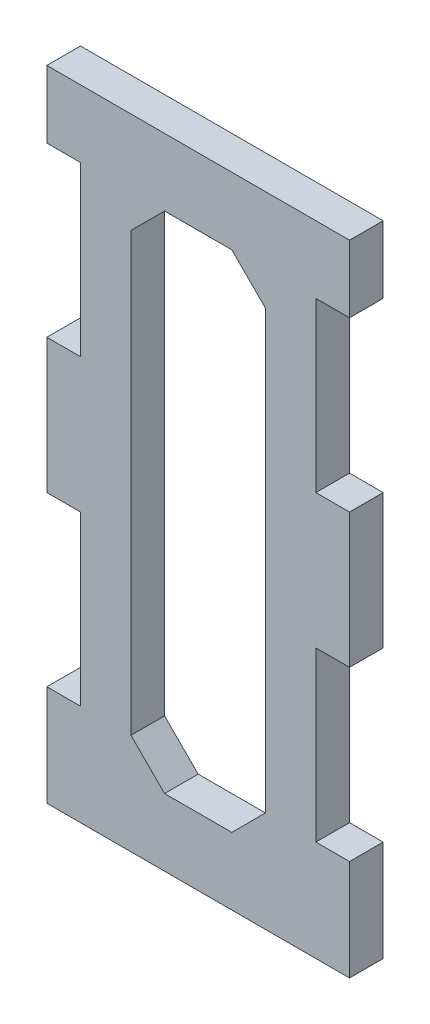
ISO-10303-21;
HEADER;
FILE_DESCRIPTION(('STEP AP214'),'2;1');
FILE_NAME('part.step','',(''),(''),'','','');
FILE_SCHEMA(('AUTOMOTIVE_DESIGN { 1 0 10303 214 1 1 1 1 }'));
ENDSEC;
DATA;
#1=APPLICATION_CONTEXT('core data for automotive mechanical design processes');
#2=APPLICATION_PROTOCOL_DEFINITION('international standard','automotive_design',2000,#1);
#3=PRODUCT_CONTEXT('',#1,'mechanical');
#4=PRODUCT('Part','Part','',(#3));
#5=PRODUCT_RELATED_PRODUCT_CATEGORY('part','',(#4));
#6=PRODUCT_DEFINITION_FORMATION('','',#4);
#7=PRODUCT_DEFINITION_CONTEXT('part definition',#1,'design');
#8=PRODUCT_DEFINITION('design','',#6,#7);
#9=PRODUCT_DEFINITION_SHAPE('','',#8);
#10=(LENGTH_UNIT() NAMED_UNIT(*) SI_UNIT(.MILLI.,.METRE.));
#11=(NAMED_UNIT(*) PLANE_ANGLE_UNIT() SI_UNIT($,.RADIAN.));
#12=(NAMED_UNIT(*) SI_UNIT($,.STERADIAN.) SOLID_ANGLE_UNIT());
#13=UNCERTAINTY_MEASURE_WITH_UNIT(LENGTH_MEASURE(1.E-05),#10,'distance_accuracy_value','');
#14=(GEOMETRIC_REPRESENTATION_CONTEXT(3) GLOBAL_UNCERTAINTY_ASSIGNED_CONTEXT((#13)) GLOBAL_UNIT_ASSIGNED_CONTEXT((#10,
#11,#12)) REPRESENTATION_CONTEXT('',''));
#15=CARTESIAN_POINT('',(0.,0.,0.));
#16=DIRECTION('',(0.,0.,1.));
#17=DIRECTION('',(1.,0.,0.));
#18=AXIS2_PLACEMENT_3D('',#15,#16,#17);
#19=CARTESIAN_POINT('',(0.,0.,10.));
#20=DIRECTION('',(1.,0.,0.));
#21=DIRECTION('',(0.,0.,-1.));
#22=AXIS2_PLACEMENT_3D('',#19,#20,#21);
#23=PLANE('',#22);
#24=DIRECTION('',(0.,-1.,0.));
#25=VECTOR('',#24,1.);
#26=CARTESIAN_POINT('',(0.,0.,0.));
#27=LINE('',#26,#25);
#28=CARTESIAN_POINT('',(0.,30.,0.));
#29=VERTEX_POINT('',#28);
#30=CARTESIAN_POINT('',(0.,0.,0.));
#31=VERTEX_POINT('',#30);
#32=EDGE_CURVE('E274',#29,#31,#27,.T.);
#33=ORIENTED_EDGE('',*,*,#32,.T.);
#34=DIRECTION('',(0.,0.,-1.));
#35=VECTOR('',#34,1.);
#36=CARTESIAN_POINT('',(0.,0.,10.));
#37=LINE('',#36,#35);
#38=CARTESIAN_POINT('',(0.,0.,10.));
#39=VERTEX_POINT('',#38);
#40=EDGE_CURVE('E11',#39,#31,#37,.T.);
#41=ORIENTED_EDGE('',*,*,#40,.F.);
#42=DIRECTION('',(0.,-1.,0.));
#43=VECTOR('',#42,1.);
#44=CARTESIAN_POINT('',(0.,0.,10.));
#45=LINE('',#44,#43);
#46=CARTESIAN_POINT('',(0.,30.,10.));
#47=VERTEX_POINT('',#46);
#48=EDGE_CURVE('E286',#47,#39,#45,.T.);
#49=ORIENTED_EDGE('',*,*,#48,.F.);
#50=DIRECTION('',(0.,0.,-1.));
#51=VECTOR('',#50,1.);
#52=CARTESIAN_POINT('',(0.,30.,10.));
#53=LINE('',#52,#51);
#54=EDGE_CURVE('E328',#47,#29,#53,.T.);
#55=ORIENTED_EDGE('',*,*,#54,.T.);
#56=EDGE_LOOP('',(#33,#41,#49,#55));
#57=FACE_BOUND('',#56,.T.);
#58=ADVANCED_FACE('F33',(#57),#23,.F.);
#59=CARTESIAN_POINT('',(0.,0.,10.));
#60=DIRECTION('',(0.,1.,0.));
#61=DIRECTION('',(-1.,0.,0.));
#62=AXIS2_PLACEMENT_3D('',#59,#60,#61);
#63=PLANE('',#62);
#64=DIRECTION('',(1.,0.,0.));
#65=VECTOR('',#64,1.);
#66=CARTESIAN_POINT('',(0.,0.,0.));
#67=LINE('',#66,#65);
#68=CARTESIAN_POINT('',(90.,0.,0.));
#69=VERTEX_POINT('',#68);
#70=EDGE_CURVE('E331',#31,#69,#67,.T.);
#71=ORIENTED_EDGE('',*,*,#70,.T.);
#72=DIRECTION('',(0.,0.,-1.));
#73=VECTOR('',#72,1.);
#74=CARTESIAN_POINT('',(90.,0.,10.));
#75=LINE('',#74,#73);
#76=CARTESIAN_POINT('',(90.,0.,10.));
#77=VERTEX_POINT('',#76);
#78=EDGE_CURVE('E40',#77,#69,#75,.T.);
#79=ORIENTED_EDGE('',*,*,#78,.F.);
#80=DIRECTION('',(1.,0.,0.));
#81=VECTOR('',#80,1.);
#82=CARTESIAN_POINT('',(0.,0.,10.));
#83=LINE('',#82,#81);
#84=EDGE_CURVE('E289',#39,#77,#83,.T.);
#85=ORIENTED_EDGE('',*,*,#84,.F.);
#86=ORIENTED_EDGE('',*,*,#40,.T.);
#87=EDGE_LOOP('',(#71,#79,#85,#86));
#88=FACE_BOUND('',#87,.T.);
#89=ADVANCED_FACE('F446',(#88),#63,.F.);
#90=CARTESIAN_POINT('',(90.,0.,10.));
#91=DIRECTION('',(-1.,0.,0.));
#92=DIRECTION('',(0.,0.,1.));
#93=AXIS2_PLACEMENT_3D('',#90,#91,#92);
#94=PLANE('',#93);
#95=DIRECTION('',(0.,1.,0.));
#96=VECTOR('',#95,1.);
#97=CARTESIAN_POINT('',(90.,0.,0.));
#98=LINE('',#97,#96);
#99=CARTESIAN_POINT('',(90.,30.,0.));
#100=VERTEX_POINT('',#99);
#101=EDGE_CURVE('E333',#69,#100,#98,.T.);
#102=ORIENTED_EDGE('',*,*,#101,.T.);
#103=DIRECTION('',(0.,0.,-1.));
#104=VECTOR('',#103,1.);
#105=CARTESIAN_POINT('',(90.,30.,10.));
#106=LINE('',#105,#104);
#107=CARTESIAN_POINT('',(90.,30.,10.));
#108=VERTEX_POINT('',#107);
#109=EDGE_CURVE('E418',#108,#100,#106,.T.);
#110=ORIENTED_EDGE('',*,*,#109,.F.);
#111=DIRECTION('',(0.,1.,0.));
#112=VECTOR('',#111,1.);
#113=CARTESIAN_POINT('',(90.,0.,10.));
#114=LINE('',#113,#112);
#115=EDGE_CURVE('E292',#77,#108,#114,.T.);
#116=ORIENTED_EDGE('',*,*,#115,.F.);
#117=ORIENTED_EDGE('',*,*,#78,.T.);
#118=EDGE_LOOP('',(#102,#110,#116,#117));
#119=FACE_BOUND('',#118,.T.);
#120=ADVANCED_FACE('F425',(#119),#94,.F.);
#121=CARTESIAN_POINT('',(90.,30.,10.));
#122=DIRECTION('',(0.,-1.,0.));
#123=DIRECTION('',(1.,0.,0.));
#124=AXIS2_PLACEMENT_3D('',#121,#122,#123);
#125=PLANE('',#124);
#126=DIRECTION('',(-1.,0.,0.));
#127=VECTOR('',#126,1.);
#128=CARTESIAN_POINT('',(90.,30.,0.));
#129=LINE('',#128,#127);
#130=CARTESIAN_POINT('',(80.,30.,0.));
#131=VERTEX_POINT('',#130);
#132=EDGE_CURVE('E335',#100,#131,#129,.T.);
#133=ORIENTED_EDGE('',*,*,#132,.T.);
#134=DIRECTION('',(0.,0.,-1.));
#135=VECTOR('',#134,1.);
#136=CARTESIAN_POINT('',(80.,30.,10.));
#137=LINE('',#136,#135);
#138=CARTESIAN_POINT('',(80.,30.,10.));
#139=VERTEX_POINT('',#138);
#140=EDGE_CURVE('E415',#139,#131,#137,.T.);
#141=ORIENTED_EDGE('',*,*,#140,.F.);
#142=DIRECTION('',(-1.,0.,0.));
#143=VECTOR('',#142,1.);
#144=CARTESIAN_POINT('',(90.,30.,10.));
#145=LINE('',#144,#143);
#146=EDGE_CURVE('E294',#108,#139,#145,.T.);
#147=ORIENTED_EDGE('',*,*,#146,.F.);
#148=ORIENTED_EDGE('',*,*,#109,.T.);
#149=EDGE_LOOP('',(#133,#141,#147,#148));
#150=FACE_BOUND('',#149,.T.);
#151=ADVANCED_FACE('F434',(#150),#125,.F.);
#152=CARTESIAN_POINT('',(80.,30.,10.));
#153=DIRECTION('',(-1.,0.,0.));
#154=DIRECTION('',(0.,-1.,0.));
#155=AXIS2_PLACEMENT_3D('',#152,#153,#154);
#156=PLANE('',#155);
#157=DIRECTION('',(0.,1.,0.));
#158=VECTOR('',#157,1.);
#159=CARTESIAN_POINT('',(80.,30.,0.));
#160=LINE('',#159,#158);
#161=CARTESIAN_POINT('',(80.,80.,0.));
#162=VERTEX_POINT('',#161);
#163=EDGE_CURVE('E337',#131,#162,#160,.T.);
#164=ORIENTED_EDGE('',*,*,#163,.T.);
#165=DIRECTION('',(0.,0.,-1.));
#166=VECTOR('',#165,1.);
#167=CARTESIAN_POINT('',(80.,80.,10.));
#168=LINE('',#167,#166);
#169=CARTESIAN_POINT('',(80.,80.,10.));
#170=VERTEX_POINT('',#169);
#171=EDGE_CURVE('E412',#170,#162,#168,.T.);
#172=ORIENTED_EDGE('',*,*,#171,.F.);
#173=DIRECTION('',(0.,1.,0.));
#174=VECTOR('',#173,1.);
#175=CARTESIAN_POINT('',(80.,30.,10.));
#176=LINE('',#175,#174);
#177=EDGE_CURVE('E296',#139,#170,#176,.T.);
#178=ORIENTED_EDGE('',*,*,#177,.F.);
#179=ORIENTED_EDGE('',*,*,#140,.T.);
#180=EDGE_LOOP('',(#164,#172,#178,#179));
#181=FACE_BOUND('',#180,.T.);
#182=ADVANCED_FACE('F438',(#181),#156,.F.);
#183=CARTESIAN_POINT('',(80.,80.,10.));
#184=DIRECTION('',(0.,1.,0.));
#185=DIRECTION('',(0.,0.,1.));
#186=AXIS2_PLACEMENT_3D('',#183,#184,#185);
#187=PLANE('',#186);
#188=DIRECTION('',(1.,0.,0.));
#189=VECTOR('',#188,1.);
#190=CARTESIAN_POINT('',(80.,80.,0.));
#191=LINE('',#190,#189);
#192=CARTESIAN_POINT('',(90.,80.,0.));
#193=VERTEX_POINT('',#192);
#194=EDGE_CURVE('E339',#162,#193,#191,.T.);
#195=ORIENTED_EDGE('',*,*,#194,.T.);
#196=DIRECTION('',(0.,0.,-1.));
#197=VECTOR('',#196,1.);
#198=CARTESIAN_POINT('',(90.,80.,10.));
#199=LINE('',#198,#197);
#200=CARTESIAN_POINT('',(90.,80.,10.));
#201=VERTEX_POINT('',#200);
#202=EDGE_CURVE('E409',#201,#193,#199,.T.);
#203=ORIENTED_EDGE('',*,*,#202,.F.);
#204=DIRECTION('',(1.,0.,0.));
#205=VECTOR('',#204,1.);
#206=CARTESIAN_POINT('',(80.,80.,10.));
#207=LINE('',#206,#205);
#208=EDGE_CURVE('E298',#170,#201,#207,.T.);
#209=ORIENTED_EDGE('',*,*,#208,.F.);
#210=ORIENTED_EDGE('',*,*,#171,.T.);
#211=EDGE_LOOP('',(#195,#203,#209,#210));
#212=FACE_BOUND('',#211,.T.);
#213=ADVANCED_FACE('F519',(#212),#187,.F.);
#214=CARTESIAN_POINT('',(90.,80.,10.));
#215=DIRECTION('',(-1.,0.,0.));
#216=DIRECTION('',(0.,-1.,0.));
#217=AXIS2_PLACEMENT_3D('',#214,#215,#216);
#218=PLANE('',#217);
#219=DIRECTION('',(0.,1.,0.));
#220=VECTOR('',#219,1.);
#221=CARTESIAN_POINT('',(90.,80.,0.));
#222=LINE('',#221,#220);
#223=CARTESIAN_POINT('',(90.,120.,0.));
#224=VERTEX_POINT('',#223);
#225=EDGE_CURVE('E341',#193,#224,#222,.T.);
#226=ORIENTED_EDGE('',*,*,#225,.T.);
#227=DIRECTION('',(0.,0.,-1.));
#228=VECTOR('',#227,1.);
#229=CARTESIAN_POINT('',(90.,120.,10.));
#230=LINE('',#229,#228);
#231=CARTESIAN_POINT('',(90.,120.,10.));
#232=VERTEX_POINT('',#231);
#233=EDGE_CURVE('E406',#232,#224,#230,.T.);
#234=ORIENTED_EDGE('',*,*,#233,.F.);
#235=DIRECTION('',(0.,1.,0.));
#236=VECTOR('',#235,1.);
#237=CARTESIAN_POINT('',(90.,80.,10.));
#238=LINE('',#237,#236);
#239=EDGE_CURVE('E300',#201,#232,#238,.T.);
#240=ORIENTED_EDGE('',*,*,#239,.F.);
#241=ORIENTED_EDGE('',*,*,#202,.T.);
#242=EDGE_LOOP('',(#226,#234,#240,#241));
#243=FACE_BOUND('',#242,.T.);
#244=ADVANCED_FACE('F517',(#243),#218,.F.);
#245=CARTESIAN_POINT('',(90.,120.,10.));
#246=DIRECTION('',(0.,-1.,0.));
#247=DIRECTION('',(0.,0.,-1.));
#248=AXIS2_PLACEMENT_3D('',#245,#246,#247);
#249=PLANE('',#248);
#250=DIRECTION('',(-1.,0.,0.));
#251=VECTOR('',#250,1.);
#252=CARTESIAN_POINT('',(90.,120.,0.));
#253=LINE('',#252,#251);
#254=CARTESIAN_POINT('',(80.,120.,0.));
#255=VERTEX_POINT('',#254);
#256=EDGE_CURVE('E343',#224,#255,#253,.T.);
#257=ORIENTED_EDGE('',*,*,#256,.T.);
#258=DIRECTION('',(0.,0.,-1.));
#259=VECTOR('',#258,1.);
#260=CARTESIAN_POINT('',(80.,120.,10.));
#261=LINE('',#260,#259);
#262=CARTESIAN_POINT('',(80.,120.,10.));
#263=VERTEX_POINT('',#262);
#264=EDGE_CURVE('E403',#263,#255,#261,.T.);
#265=ORIENTED_EDGE('',*,*,#264,.F.);
#266=DIRECTION('',(-1.,0.,0.));
#267=VECTOR('',#266,1.);
#268=CARTESIAN_POINT('',(90.,120.,10.));
#269=LINE('',#268,#267);
#270=EDGE_CURVE('E302',#232,#263,#269,.T.);
#271=ORIENTED_EDGE('',*,*,#270,.F.);
#272=ORIENTED_EDGE('',*,*,#233,.T.);
#273=EDGE_LOOP('',(#257,#265,#271,#272));
#274=FACE_BOUND('',#273,.T.);
#275=ADVANCED_FACE('F512',(#274),#249,.F.);
#276=CARTESIAN_POINT('',(80.,120.,10.));
#277=DIRECTION('',(-1.,0.,0.));
#278=DIRECTION('',(0.,-1.,0.));
#279=AXIS2_PLACEMENT_3D('',#276,#277,#278);
#280=PLANE('',#279);
#281=DIRECTION('',(0.,1.,0.));
#282=VECTOR('',#281,1.);
#283=CARTESIAN_POINT('',(80.,120.,0.));
#284=LINE('',#283,#282);
#285=CARTESIAN_POINT('',(79.9999999999999,170.,0.));
#286=VERTEX_POINT('',#285);
#287=EDGE_CURVE('E345',#255,#286,#284,.T.);
#288=ORIENTED_EDGE('',*,*,#287,.T.);
#289=DIRECTION('',(0.,0.,-1.));
#290=VECTOR('',#289,1.);
#291=CARTESIAN_POINT('',(79.9999999999999,170.,10.));
#292=LINE('',#291,#290);
#293=CARTESIAN_POINT('',(79.9999999999999,170.,10.));
#294=VERTEX_POINT('',#293);
#295=EDGE_CURVE('E400',#294,#286,#292,.T.);
#296=ORIENTED_EDGE('',*,*,#295,.F.);
#297=DIRECTION('',(0.,1.,0.));
#298=VECTOR('',#297,1.);
#299=CARTESIAN_POINT('',(80.,120.,10.));
#300=LINE('',#299,#298);
#301=EDGE_CURVE('E304',#263,#294,#300,.T.);
#302=ORIENTED_EDGE('',*,*,#301,.F.);
#303=ORIENTED_EDGE('',*,*,#264,.T.);
#304=EDGE_LOOP('',(#288,#296,#302,#303));
#305=FACE_BOUND('',#304,.T.);
#306=ADVANCED_FACE('F507',(#305),#280,.F.);
#307=CARTESIAN_POINT('',(79.9999999999999,170.,10.));
#308=DIRECTION('',(0.,1.,0.));
#309=DIRECTION('',(0.,0.,1.));
#310=AXIS2_PLACEMENT_3D('',#307,#308,#309);
#311=PLANE('',#310);
#312=DIRECTION('',(1.,0.,0.));
#313=VECTOR('',#312,1.);
#314=CARTESIAN_POINT('',(79.9999999999999,170.,0.));
#315=LINE('',#314,#313);
#316=CARTESIAN_POINT('',(90.,170.,0.));
#317=VERTEX_POINT('',#316);
#318=EDGE_CURVE('E347',#286,#317,#315,.T.);
#319=ORIENTED_EDGE('',*,*,#318,.T.);
#320=DIRECTION('',(0.,0.,-1.));
#321=VECTOR('',#320,1.);
#322=CARTESIAN_POINT('',(90.,170.,10.));
#323=LINE('',#322,#321);
#324=CARTESIAN_POINT('',(90.,170.,10.));
#325=VERTEX_POINT('',#324);
#326=EDGE_CURVE('E397',#325,#317,#323,.T.);
#327=ORIENTED_EDGE('',*,*,#326,.F.);
#328=DIRECTION('',(1.,0.,0.));
#329=VECTOR('',#328,1.);
#330=CARTESIAN_POINT('',(79.9999999999999,170.,10.));
#331=LINE('',#330,#329);
#332=EDGE_CURVE('E306',#294,#325,#331,.T.);
#333=ORIENTED_EDGE('',*,*,#332,.F.);
#334=ORIENTED_EDGE('',*,*,#295,.T.);
#335=EDGE_LOOP('',(#319,#327,#333,#334));
#336=FACE_BOUND('',#335,.T.);
#337=ADVANCED_FACE('F503',(#336),#311,.F.);
#338=CARTESIAN_POINT('',(90.,170.,10.));
#339=DIRECTION('',(-1.,0.,0.));
#340=DIRECTION('',(0.,-1.,0.));
#341=AXIS2_PLACEMENT_3D('',#338,#339,#340);
#342=PLANE('',#341);
#343=DIRECTION('',(0.,1.,0.));
#344=VECTOR('',#343,1.);
#345=CARTESIAN_POINT('',(90.,170.,0.));
#346=LINE('',#345,#344);
#347=CARTESIAN_POINT('',(89.9999999999999,190.,0.));
#348=VERTEX_POINT('',#347);
#349=EDGE_CURVE('E349',#317,#348,#346,.T.);
#350=ORIENTED_EDGE('',*,*,#349,.T.);
#351=DIRECTION('',(0.,0.,-1.));
#352=VECTOR('',#351,1.);
#353=CARTESIAN_POINT('',(89.9999999999999,190.,10.));
#354=LINE('',#353,#352);
#355=CARTESIAN_POINT('',(89.9999999999999,190.,10.));
#356=VERTEX_POINT('',#355);
#357=EDGE_CURVE('E394',#356,#348,#354,.T.);
#358=ORIENTED_EDGE('',*,*,#357,.F.);
#359=DIRECTION('',(0.,1.,0.));
#360=VECTOR('',#359,1.);
#361=CARTESIAN_POINT('',(90.,170.,10.));
#362=LINE('',#361,#360);
#363=EDGE_CURVE('E308',#325,#356,#362,.T.);
#364=ORIENTED_EDGE('',*,*,#363,.F.);
#365=ORIENTED_EDGE('',*,*,#326,.T.);
#366=EDGE_LOOP('',(#350,#358,#364,#365));
#367=FACE_BOUND('',#366,.T.);
#368=ADVANCED_FACE('F498',(#367),#342,.F.);
#369=CARTESIAN_POINT('',(0.,190.,10.));
#370=DIRECTION('',(0.,-1.,0.));
#371=DIRECTION('',(0.,0.,-1.));
#372=AXIS2_PLACEMENT_3D('',#369,#370,#371);
#373=PLANE('',#372);
#374=DIRECTION('',(-1.,0.,0.));
#375=VECTOR('',#374,1.);
#376=CARTESIAN_POINT('',(0.,190.,0.));
#377=LINE('',#376,#375);
#378=CARTESIAN_POINT('',(0.,190.,0.));
#379=VERTEX_POINT('',#378);
#380=EDGE_CURVE('E351',#348,#379,#377,.T.);
#381=ORIENTED_EDGE('',*,*,#380,.T.);
#382=DIRECTION('',(0.,0.,-1.));
#383=VECTOR('',#382,1.);
#384=CARTESIAN_POINT('',(0.,190.,10.));
#385=LINE('',#384,#383);
#386=CARTESIAN_POINT('',(0.,190.,10.));
#387=VERTEX_POINT('',#386);
#388=EDGE_CURVE('E391',#387,#379,#385,.T.);
#389=ORIENTED_EDGE('',*,*,#388,.F.);
#390=DIRECTION('',(-1.,0.,0.));
#391=VECTOR('',#390,1.);
#392=CARTESIAN_POINT('',(0.,190.,10.));
#393=LINE('',#392,#391);
#394=EDGE_CURVE('E310',#356,#387,#393,.T.);
#395=ORIENTED_EDGE('',*,*,#394,.F.);
#396=ORIENTED_EDGE('',*,*,#357,.T.);
#397=EDGE_LOOP('',(#381,#389,#395,#396));
#398=FACE_BOUND('',#397,.T.);
#399=ADVANCED_FACE('F492',(#398),#373,.F.);
#400=CARTESIAN_POINT('',(0.,170.,10.));
#401=DIRECTION('',(1.,0.,0.));
#402=DIRECTION('',(0.,0.,-1.));
#403=AXIS2_PLACEMENT_3D('',#400,#401,#402);
#404=PLANE('',#403);
#405=DIRECTION('',(0.,-1.,0.));
#406=VECTOR('',#405,1.);
#407=CARTESIAN_POINT('',(0.,170.,0.));
#408=LINE('',#407,#406);
#409=CARTESIAN_POINT('',(0.,170.,0.));
#410=VERTEX_POINT('',#409);
#411=EDGE_CURVE('E353',#379,#410,#408,.T.);
#412=ORIENTED_EDGE('',*,*,#411,.T.);
#413=DIRECTION('',(0.,0.,-1.));
#414=VECTOR('',#413,1.);
#415=CARTESIAN_POINT('',(0.,170.,10.));
#416=LINE('',#415,#414);
#417=CARTESIAN_POINT('',(0.,170.,10.));
#418=VERTEX_POINT('',#417);
#419=EDGE_CURVE('E388',#418,#410,#416,.T.);
#420=ORIENTED_EDGE('',*,*,#419,.F.);
#421=DIRECTION('',(0.,-1.,0.));
#422=VECTOR('',#421,1.);
#423=CARTESIAN_POINT('',(0.,170.,10.));
#424=LINE('',#423,#422);
#425=EDGE_CURVE('E312',#387,#418,#424,.T.);
#426=ORIENTED_EDGE('',*,*,#425,.F.);
#427=ORIENTED_EDGE('',*,*,#388,.T.);
#428=EDGE_LOOP('',(#412,#420,#426,#427));
#429=FACE_BOUND('',#428,.T.);
#430=ADVANCED_FACE('F488',(#429),#404,.F.);
#431=CARTESIAN_POINT('',(10.,170.,10.));
#432=DIRECTION('',(0.,1.,0.));
#433=DIRECTION('',(0.,0.,1.));
#434=AXIS2_PLACEMENT_3D('',#431,#432,#433);
#435=PLANE('',#434);
#436=DIRECTION('',(1.,0.,0.));
#437=VECTOR('',#436,1.);
#438=CARTESIAN_POINT('',(10.,170.,0.));
#439=LINE('',#438,#437);
#440=CARTESIAN_POINT('',(10.,170.,0.));
#441=VERTEX_POINT('',#440);
#442=EDGE_CURVE('E355',#410,#441,#439,.T.);
#443=ORIENTED_EDGE('',*,*,#442,.T.);
#444=DIRECTION('',(0.,0.,-1.));
#445=VECTOR('',#444,1.);
#446=CARTESIAN_POINT('',(10.,170.,10.));
#447=LINE('',#446,#445);
#448=CARTESIAN_POINT('',(10.,170.,10.));
#449=VERTEX_POINT('',#448);
#450=EDGE_CURVE('E385',#449,#441,#447,.T.);
#451=ORIENTED_EDGE('',*,*,#450,.F.);
#452=DIRECTION('',(1.,0.,0.));
#453=VECTOR('',#452,1.);
#454=CARTESIAN_POINT('',(10.,170.,10.));
#455=LINE('',#454,#453);
#456=EDGE_CURVE('E314',#418,#449,#455,.T.);
#457=ORIENTED_EDGE('',*,*,#456,.F.);
#458=ORIENTED_EDGE('',*,*,#419,.T.);
#459=EDGE_LOOP('',(#443,#451,#457,#458));
#460=FACE_BOUND('',#459,.T.);
#461=ADVANCED_FACE('F483',(#460),#435,.F.);
#462=CARTESIAN_POINT('',(10.,120.,10.));
#463=DIRECTION('',(1.,0.,0.));
#464=DIRECTION('',(0.,1.,0.));
#465=AXIS2_PLACEMENT_3D('',#462,#463,#464);
#466=PLANE('',#465);
#467=DIRECTION('',(0.,-1.,0.));
#468=VECTOR('',#467,1.);
#469=CARTESIAN_POINT('',(10.,120.,0.));
#470=LINE('',#469,#468);
#471=CARTESIAN_POINT('',(10.,120.,0.));
#472=VERTEX_POINT('',#471);
#473=EDGE_CURVE('E357',#441,#472,#470,.T.);
#474=ORIENTED_EDGE('',*,*,#473,.T.);
#475=DIRECTION('',(0.,0.,-1.));
#476=VECTOR('',#475,1.);
#477=CARTESIAN_POINT('',(10.,120.,10.));
#478=LINE('',#477,#476);
#479=CARTESIAN_POINT('',(10.,120.,10.));
#480=VERTEX_POINT('',#479);
#481=EDGE_CURVE('E382',#480,#472,#478,.T.);
#482=ORIENTED_EDGE('',*,*,#481,.F.);
#483=DIRECTION('',(0.,-1.,0.));
#484=VECTOR('',#483,1.);
#485=CARTESIAN_POINT('',(10.,120.,10.));
#486=LINE('',#485,#484);
#487=EDGE_CURVE('E316',#449,#480,#486,.T.);
#488=ORIENTED_EDGE('',*,*,#487,.F.);
#489=ORIENTED_EDGE('',*,*,#450,.T.);
#490=EDGE_LOOP('',(#474,#482,#488,#489));
#491=FACE_BOUND('',#490,.T.);
#492=ADVANCED_FACE('F477',(#491),#466,.F.);
#493=CARTESIAN_POINT('',(0.,120.,10.));
#494=DIRECTION('',(0.,-1.,0.));
#495=DIRECTION('',(0.,0.,-1.));
#496=AXIS2_PLACEMENT_3D('',#493,#494,#495);
#497=PLANE('',#496);
#498=DIRECTION('',(-1.,0.,0.));
#499=VECTOR('',#498,1.);
#500=CARTESIAN_POINT('',(0.,120.,0.));
#501=LINE('',#500,#499);
#502=CARTESIAN_POINT('',(0.,120.,0.));
#503=VERTEX_POINT('',#502);
#504=EDGE_CURVE('E359',#472,#503,#501,.T.);
#505=ORIENTED_EDGE('',*,*,#504,.T.);
#506=DIRECTION('',(0.,0.,-1.));
#507=VECTOR('',#506,1.);
#508=CARTESIAN_POINT('',(0.,120.,10.));
#509=LINE('',#508,#507);
#510=CARTESIAN_POINT('',(0.,120.,10.));
#511=VERTEX_POINT('',#510);
#512=EDGE_CURVE('E379',#511,#503,#509,.T.);
#513=ORIENTED_EDGE('',*,*,#512,.F.);
#514=DIRECTION('',(-1.,0.,0.));
#515=VECTOR('',#514,1.);
#516=CARTESIAN_POINT('',(0.,120.,10.));
#517=LINE('',#516,#515);
#518=EDGE_CURVE('E318',#480,#511,#517,.T.);
#519=ORIENTED_EDGE('',*,*,#518,.F.);
#520=ORIENTED_EDGE('',*,*,#481,.T.);
#521=EDGE_LOOP('',(#505,#513,#519,#520));
#522=FACE_BOUND('',#521,.T.);
#523=ADVANCED_FACE('F473',(#522),#497,.F.);
#524=CARTESIAN_POINT('',(0.,80.,10.));
#525=DIRECTION('',(1.,0.,0.));
#526=DIRECTION('',(0.,1.,0.));
#527=AXIS2_PLACEMENT_3D('',#524,#525,#526);
#528=PLANE('',#527);
#529=DIRECTION('',(0.,-1.,0.));
#530=VECTOR('',#529,1.);
#531=CARTESIAN_POINT('',(0.,80.,0.));
#532=LINE('',#531,#530);
#533=CARTESIAN_POINT('',(0.,80.,0.));
#534=VERTEX_POINT('',#533);
#535=EDGE_CURVE('E361',#503,#534,#532,.T.);
#536=ORIENTED_EDGE('',*,*,#535,.T.);
#537=DIRECTION('',(0.,0.,-1.));
#538=VECTOR('',#537,1.);
#539=CARTESIAN_POINT('',(0.,80.,10.));
#540=LINE('',#539,#538);
#541=CARTESIAN_POINT('',(0.,80.,10.));
#542=VERTEX_POINT('',#541);
#543=EDGE_CURVE('E376',#542,#534,#540,.T.);
#544=ORIENTED_EDGE('',*,*,#543,.F.);
#545=DIRECTION('',(0.,-1.,0.));
#546=VECTOR('',#545,1.);
#547=CARTESIAN_POINT('',(0.,80.,10.));
#548=LINE('',#547,#546);
#549=EDGE_CURVE('E320',#511,#542,#548,.T.);
#550=ORIENTED_EDGE('',*,*,#549,.F.);
#551=ORIENTED_EDGE('',*,*,#512,.T.);
#552=EDGE_LOOP('',(#536,#544,#550,#551));
#553=FACE_BOUND('',#552,.T.);
#554=ADVANCED_FACE('F468',(#553),#528,.F.);
#555=CARTESIAN_POINT('',(10.,80.,10.));
#556=DIRECTION('',(0.,1.,0.));
#557=DIRECTION('',(0.,0.,1.));
#558=AXIS2_PLACEMENT_3D('',#555,#556,#557);
#559=PLANE('',#558);
#560=DIRECTION('',(1.,0.,0.));
#561=VECTOR('',#560,1.);
#562=CARTESIAN_POINT('',(10.,80.,0.));
#563=LINE('',#562,#561);
#564=CARTESIAN_POINT('',(10.,80.,0.));
#565=VERTEX_POINT('',#564);
#566=EDGE_CURVE('E363',#534,#565,#563,.T.);
#567=ORIENTED_EDGE('',*,*,#566,.T.);
#568=DIRECTION('',(0.,0.,-1.));
#569=VECTOR('',#568,1.);
#570=CARTESIAN_POINT('',(10.,80.,10.));
#571=LINE('',#570,#569);
#572=CARTESIAN_POINT('',(10.,80.,10.));
#573=VERTEX_POINT('',#572);
#574=EDGE_CURVE('E373',#573,#565,#571,.T.);
#575=ORIENTED_EDGE('',*,*,#574,.F.);
#576=DIRECTION('',(1.,0.,0.));
#577=VECTOR('',#576,1.);
#578=CARTESIAN_POINT('',(10.,80.,10.));
#579=LINE('',#578,#577);
#580=EDGE_CURVE('E322',#542,#573,#579,.T.);
#581=ORIENTED_EDGE('',*,*,#580,.F.);
#582=ORIENTED_EDGE('',*,*,#543,.T.);
#583=EDGE_LOOP('',(#567,#575,#581,#582));
#584=FACE_BOUND('',#583,.T.);
#585=ADVANCED_FACE('F462',(#584),#559,.F.);
#586=CARTESIAN_POINT('',(10.,30.,10.));
#587=DIRECTION('',(1.,0.,0.));
#588=DIRECTION('',(0.,1.,0.));
#589=AXIS2_PLACEMENT_3D('',#586,#587,#588);
#590=PLANE('',#589);
#591=DIRECTION('',(0.,-1.,0.));
#592=VECTOR('',#591,1.);
#593=CARTESIAN_POINT('',(10.,30.,0.));
#594=LINE('',#593,#592);
#595=CARTESIAN_POINT('',(10.,30.,0.));
#596=VERTEX_POINT('',#595);
#597=EDGE_CURVE('E365',#565,#596,#594,.T.);
#598=ORIENTED_EDGE('',*,*,#597,.T.);
#599=DIRECTION('',(0.,0.,-1.));
#600=VECTOR('',#599,1.);
#601=CARTESIAN_POINT('',(10.,30.,10.));
#602=LINE('',#601,#600);
#603=CARTESIAN_POINT('',(10.,30.,10.));
#604=VERTEX_POINT('',#603);
#605=EDGE_CURVE('E370',#604,#596,#602,.T.);
#606=ORIENTED_EDGE('',*,*,#605,.F.);
#607=DIRECTION('',(0.,-1.,0.));
#608=VECTOR('',#607,1.);
#609=CARTESIAN_POINT('',(10.,30.,10.));
#610=LINE('',#609,#608);
#611=EDGE_CURVE('E324',#573,#604,#610,.T.);
#612=ORIENTED_EDGE('',*,*,#611,.F.);
#613=ORIENTED_EDGE('',*,*,#574,.T.);
#614=EDGE_LOOP('',(#598,#606,#612,#613));
#615=FACE_BOUND('',#614,.T.);
#616=ADVANCED_FACE('F458',(#615),#590,.F.);
#617=CARTESIAN_POINT('',(0.,30.,10.));
#618=DIRECTION('',(0.,-1.,0.));
#619=DIRECTION('',(0.,0.,-1.));
#620=AXIS2_PLACEMENT_3D('',#617,#618,#619);
#621=PLANE('',#620);
#622=DIRECTION('',(-1.,0.,0.));
#623=VECTOR('',#622,1.);
#624=CARTESIAN_POINT('',(0.,30.,0.));
#625=LINE('',#624,#623);
#626=EDGE_CURVE('E290',#596,#29,#625,.T.);
#627=ORIENTED_EDGE('',*,*,#626,.T.);
#628=ORIENTED_EDGE('',*,*,#54,.F.);
#629=DIRECTION('',(-1.,0.,0.));
#630=VECTOR('',#629,1.);
#631=CARTESIAN_POINT('',(0.,30.,10.));
#632=LINE('',#631,#630);
#633=EDGE_CURVE('E326',#604,#47,#632,.T.);
#634=ORIENTED_EDGE('',*,*,#633,.F.);
#635=ORIENTED_EDGE('',*,*,#605,.T.);
#636=EDGE_LOOP('',(#627,#628,#634,#635));
#637=FACE_BOUND('',#636,.T.);
#638=ADVANCED_FACE('F453',(#637),#621,.F.);
#639=CARTESIAN_POINT('',(0.,0.,10.));
#640=DIRECTION('',(0.,0.,-1.));
#641=DIRECTION('',(-1.,0.,0.));
#642=AXIS2_PLACEMENT_3D('',#639,#640,#641);
#643=PLANE('',#642);
#644=DIRECTION('',(0.,-1.,0.));
#645=VECTOR('',#644,1.);
#646=CARTESIAN_POINT('',(25.,160.,10.));
#647=LINE('',#646,#645);
#648=CARTESIAN_POINT('',(25.,160.,10.));
#649=VERTEX_POINT('',#648);
#650=CARTESIAN_POINT('',(25.,30.,10.));
#651=VERTEX_POINT('',#650);
#652=EDGE_CURVE('E256',#649,#651,#647,.T.);
#653=ORIENTED_EDGE('',*,*,#652,.F.);
#654=DIRECTION('',(-0.707106781186547,-0.707106781186548,0.));
#655=VECTOR('',#654,1.);
#656=CARTESIAN_POINT('',(25.,160.,10.));
#657=LINE('',#656,#655);
#658=CARTESIAN_POINT('',(35.,170.,10.));
#659=VERTEX_POINT('',#658);
#660=EDGE_CURVE('E47',#659,#649,#657,.T.);
#661=ORIENTED_EDGE('',*,*,#660,.F.);
#662=DIRECTION('',(-1.,0.,0.));
#663=VECTOR('',#662,1.);
#664=CARTESIAN_POINT('',(35.,170.,10.));
#665=LINE('',#664,#663);
#666=CARTESIAN_POINT('',(55.,170.,10.));
#667=VERTEX_POINT('',#666);
#668=EDGE_CURVE('E236',#667,#659,#665,.T.);
#669=ORIENTED_EDGE('',*,*,#668,.F.);
#670=DIRECTION('',(-0.707106781186547,0.707106781186548,0.));
#671=VECTOR('',#670,1.);
#672=CARTESIAN_POINT('',(55.,170.,10.));
#673=LINE('',#672,#671);
#674=CARTESIAN_POINT('',(65.,160.,10.));
#675=VERTEX_POINT('',#674);
#676=EDGE_CURVE('E239',#675,#667,#673,.T.);
#677=ORIENTED_EDGE('',*,*,#676,.F.);
#678=DIRECTION('',(0.,1.,0.));
#679=VECTOR('',#678,1.);
#680=CARTESIAN_POINT('',(65.,160.,10.));
#681=LINE('',#680,#679);
#682=CARTESIAN_POINT('',(65.,30.,10.));
#683=VERTEX_POINT('',#682);
#684=EDGE_CURVE('E267',#683,#675,#681,.T.);
#685=ORIENTED_EDGE('',*,*,#684,.F.);
#686=DIRECTION('',(0.707106781186548,0.707106781186547,0.));
#687=VECTOR('',#686,1.);
#688=CARTESIAN_POINT('',(55.,20.,10.));
#689=LINE('',#688,#687);
#690=CARTESIAN_POINT('',(55.,20.,10.));
#691=VERTEX_POINT('',#690);
#692=EDGE_CURVE('E264',#691,#683,#689,.T.);
#693=ORIENTED_EDGE('',*,*,#692,.F.);
#694=DIRECTION('',(1.,0.,0.));
#695=VECTOR('',#694,1.);
#696=CARTESIAN_POINT('',(35.,20.,10.));
#697=LINE('',#696,#695);
#698=CARTESIAN_POINT('',(35.,20.,10.));
#699=VERTEX_POINT('',#698);
#700=EDGE_CURVE('E261',#699,#691,#697,.T.);
#701=ORIENTED_EDGE('',*,*,#700,.F.);
#702=DIRECTION('',(0.707106781186548,-0.707106781186548,0.));
#703=VECTOR('',#702,1.);
#704=CARTESIAN_POINT('',(25.,30.,10.));
#705=LINE('',#704,#703);
#706=EDGE_CURVE('E258',#651,#699,#705,.T.);
#707=ORIENTED_EDGE('',*,*,#706,.F.);
#708=EDGE_LOOP('',(#653,#661,#669,#677,#685,#693,#701,#707));
#709=FACE_BOUND('',#708,.T.);
#710=ORIENTED_EDGE('',*,*,#48,.T.);
#711=ORIENTED_EDGE('',*,*,#84,.T.);
#712=ORIENTED_EDGE('',*,*,#115,.T.);
#713=ORIENTED_EDGE('',*,*,#146,.T.);
#714=ORIENTED_EDGE('',*,*,#177,.T.);
#715=ORIENTED_EDGE('',*,*,#208,.T.);
#716=ORIENTED_EDGE('',*,*,#239,.T.);
#717=ORIENTED_EDGE('',*,*,#270,.T.);
#718=ORIENTED_EDGE('',*,*,#301,.T.);
#719=ORIENTED_EDGE('',*,*,#332,.T.);
#720=ORIENTED_EDGE('',*,*,#363,.T.);
#721=ORIENTED_EDGE('',*,*,#394,.T.);
#722=ORIENTED_EDGE('',*,*,#425,.T.);
#723=ORIENTED_EDGE('',*,*,#456,.T.);
#724=ORIENTED_EDGE('',*,*,#487,.T.);
#725=ORIENTED_EDGE('',*,*,#518,.T.);
#726=ORIENTED_EDGE('',*,*,#549,.T.);
#727=ORIENTED_EDGE('',*,*,#580,.T.);
#728=ORIENTED_EDGE('',*,*,#611,.T.);
#729=ORIENTED_EDGE('',*,*,#633,.T.);
#730=EDGE_LOOP('',(#710,#711,#712,#713,#714,#715,#716,#717,#718,#719,#720,#721,#722,#723,#724,
#725,#726,#727,#728,#729));
#731=FACE_BOUND('',#730,.T.);
#732=ADVANCED_FACE('F442',(#709,#731),#643,.F.);
#733=CARTESIAN_POINT('',(0.,0.,0.));
#734=DIRECTION('',(0.,0.,-1.));
#735=DIRECTION('',(-1.,0.,0.));
#736=AXIS2_PLACEMENT_3D('',#733,#734,#735);
#737=PLANE('',#736);
#738=DIRECTION('',(-0.707106781186547,-0.707106781186548,0.));
#739=VECTOR('',#738,1.);
#740=CARTESIAN_POINT('',(25.,160.,0.));
#741=LINE('',#740,#739);
#742=CARTESIAN_POINT('',(35.,170.,0.));
#743=VERTEX_POINT('',#742);
#744=CARTESIAN_POINT('',(25.,160.,0.));
#745=VERTEX_POINT('',#744);
#746=EDGE_CURVE('E219',#743,#745,#741,.T.);
#747=ORIENTED_EDGE('',*,*,#746,.T.);
#748=DIRECTION('',(0.,-1.,0.));
#749=VECTOR('',#748,1.);
#750=CARTESIAN_POINT('',(25.,160.,0.));
#751=LINE('',#750,#749);
#752=CARTESIAN_POINT('',(25.,30.,0.));
#753=VERTEX_POINT('',#752);
#754=EDGE_CURVE('E228',#745,#753,#751,.T.);
#755=ORIENTED_EDGE('',*,*,#754,.T.);
#756=DIRECTION('',(0.707106781186548,-0.707106781186548,0.));
#757=VECTOR('',#756,1.);
#758=CARTESIAN_POINT('',(25.,30.,0.));
#759=LINE('',#758,#757);
#760=CARTESIAN_POINT('',(35.,20.,0.));
#761=VERTEX_POINT('',#760);
#762=EDGE_CURVE('E55',#753,#761,#759,.T.);
#763=ORIENTED_EDGE('',*,*,#762,.T.);
#764=DIRECTION('',(1.,0.,0.));
#765=VECTOR('',#764,1.);
#766=CARTESIAN_POINT('',(35.,20.,0.));
#767=LINE('',#766,#765);
#768=CARTESIAN_POINT('',(55.,20.,0.));
#769=VERTEX_POINT('',#768);
#770=EDGE_CURVE('E243',#761,#769,#767,.T.);
#771=ORIENTED_EDGE('',*,*,#770,.T.);
#772=DIRECTION('',(0.707106781186548,0.707106781186547,0.));
#773=VECTOR('',#772,1.);
#774=CARTESIAN_POINT('',(55.,20.,0.));
#775=LINE('',#774,#773);
#776=CARTESIAN_POINT('',(65.,30.,0.));
#777=VERTEX_POINT('',#776);
#778=EDGE_CURVE('E246',#769,#777,#775,.T.);
#779=ORIENTED_EDGE('',*,*,#778,.T.);
#780=DIRECTION('',(0.,1.,0.));
#781=VECTOR('',#780,1.);
#782=CARTESIAN_POINT('',(65.,160.,0.));
#783=LINE('',#782,#781);
#784=CARTESIAN_POINT('',(65.,160.,0.));
#785=VERTEX_POINT('',#784);
#786=EDGE_CURVE('E249',#777,#785,#783,.T.);
#787=ORIENTED_EDGE('',*,*,#786,.T.);
#788=DIRECTION('',(-0.707106781186547,0.707106781186548,0.));
#789=VECTOR('',#788,1.);
#790=CARTESIAN_POINT('',(55.,170.,0.));
#791=LINE('',#790,#789);
#792=CARTESIAN_POINT('',(55.,170.,0.));
#793=VERTEX_POINT('',#792);
#794=EDGE_CURVE('E252',#785,#793,#791,.T.);
#795=ORIENTED_EDGE('',*,*,#794,.T.);
#796=DIRECTION('',(-1.,0.,0.));
#797=VECTOR('',#796,1.);
#798=CARTESIAN_POINT('',(35.,170.,0.));
#799=LINE('',#798,#797);
#800=EDGE_CURVE('E225',#793,#743,#799,.T.);
#801=ORIENTED_EDGE('',*,*,#800,.T.);
#802=EDGE_LOOP('',(#747,#755,#763,#771,#779,#787,#795,#801));
#803=FACE_BOUND('',#802,.T.);
#804=ORIENTED_EDGE('',*,*,#32,.F.);
#805=ORIENTED_EDGE('',*,*,#626,.F.);
#806=ORIENTED_EDGE('',*,*,#597,.F.);
#807=ORIENTED_EDGE('',*,*,#566,.F.);
#808=ORIENTED_EDGE('',*,*,#535,.F.);
#809=ORIENTED_EDGE('',*,*,#504,.F.);
#810=ORIENTED_EDGE('',*,*,#473,.F.);
#811=ORIENTED_EDGE('',*,*,#442,.F.);
#812=ORIENTED_EDGE('',*,*,#411,.F.);
#813=ORIENTED_EDGE('',*,*,#380,.F.);
#814=ORIENTED_EDGE('',*,*,#349,.F.);
#815=ORIENTED_EDGE('',*,*,#318,.F.);
#816=ORIENTED_EDGE('',*,*,#287,.F.);
#817=ORIENTED_EDGE('',*,*,#256,.F.);
#818=ORIENTED_EDGE('',*,*,#225,.F.);
#819=ORIENTED_EDGE('',*,*,#194,.F.);
#820=ORIENTED_EDGE('',*,*,#163,.F.);
#821=ORIENTED_EDGE('',*,*,#132,.F.);
#822=ORIENTED_EDGE('',*,*,#101,.F.);
#823=ORIENTED_EDGE('',*,*,#70,.F.);
#824=EDGE_LOOP('',(#804,#805,#806,#807,#808,#809,#810,#811,#812,#813,#814,#815,#816,#817,#818,
#819,#820,#821,#822,#823));
#825=FACE_BOUND('',#824,.T.);
#826=ADVANCED_FACE('F232',(#803,#825),#737,.T.);
#827=CARTESIAN_POINT('',(25.,160.,0.));
#828=DIRECTION('',(-0.707106781186548,0.707106781186547,0.));
#829=DIRECTION('',(-0.707106781186547,-0.707106781186548,0.));
#830=AXIS2_PLACEMENT_3D('',#827,#828,#829);
#831=PLANE('',#830);
#832=ORIENTED_EDGE('',*,*,#660,.T.);
#833=DIRECTION('',(0.,0.,1.));
#834=VECTOR('',#833,1.);
#835=CARTESIAN_POINT('',(25.,160.,0.));
#836=LINE('',#835,#834);
#837=EDGE_CURVE('E215',#745,#649,#836,.T.);
#838=ORIENTED_EDGE('',*,*,#837,.F.);
#839=ORIENTED_EDGE('',*,*,#746,.F.);
#840=DIRECTION('',(0.,0.,1.));
#841=VECTOR('',#840,1.);
#842=CARTESIAN_POINT('',(35.,170.,0.));
#843=LINE('',#842,#841);
#844=EDGE_CURVE('E272',#743,#659,#843,.T.);
#845=ORIENTED_EDGE('',*,*,#844,.T.);
#846=EDGE_LOOP('',(#832,#838,#839,#845));
#847=FACE_BOUND('',#846,.T.);
#848=ADVANCED_FACE('F217',(#847),#831,.F.);
#849=CARTESIAN_POINT('',(35.,170.,0.));
#850=DIRECTION('',(0.,1.,0.));
#851=DIRECTION('',(0.,0.,1.));
#852=AXIS2_PLACEMENT_3D('',#849,#850,#851);
#853=PLANE('',#852);
#854=ORIENTED_EDGE('',*,*,#668,.T.);
#855=ORIENTED_EDGE('',*,*,#844,.F.);
#856=ORIENTED_EDGE('',*,*,#800,.F.);
#857=DIRECTION('',(0.,0.,1.));
#858=VECTOR('',#857,1.);
#859=CARTESIAN_POINT('',(55.,170.,0.));
#860=LINE('',#859,#858);
#861=EDGE_CURVE('E275',#793,#667,#860,.T.);
#862=ORIENTED_EDGE('',*,*,#861,.T.);
#863=EDGE_LOOP('',(#854,#855,#856,#862));
#864=FACE_BOUND('',#863,.T.);
#865=ADVANCED_FACE('F686',(#864),#853,.F.);
#866=CARTESIAN_POINT('',(55.,170.,0.));
#867=DIRECTION('',(0.707106781186548,0.707106781186547,0.));
#868=DIRECTION('',(-0.707106781186547,0.707106781186548,0.));
#869=AXIS2_PLACEMENT_3D('',#866,#867,#868);
#870=PLANE('',#869);
#871=ORIENTED_EDGE('',*,*,#676,.T.);
#872=ORIENTED_EDGE('',*,*,#861,.F.);
#873=ORIENTED_EDGE('',*,*,#794,.F.);
#874=DIRECTION('',(0.,0.,1.));
#875=VECTOR('',#874,1.);
#876=CARTESIAN_POINT('',(65.,160.,0.));
#877=LINE('',#876,#875);
#878=EDGE_CURVE('E277',#785,#675,#877,.T.);
#879=ORIENTED_EDGE('',*,*,#878,.T.);
#880=EDGE_LOOP('',(#871,#872,#873,#879));
#881=FACE_BOUND('',#880,.T.);
#882=ADVANCED_FACE('F695',(#881),#870,.F.);
#883=CARTESIAN_POINT('',(65.,160.,0.));
#884=DIRECTION('',(1.,0.,0.));
#885=DIRECTION('',(0.,1.,0.));
#886=AXIS2_PLACEMENT_3D('',#883,#884,#885);
#887=PLANE('',#886);
#888=ORIENTED_EDGE('',*,*,#684,.T.);
#889=ORIENTED_EDGE('',*,*,#878,.F.);
#890=ORIENTED_EDGE('',*,*,#786,.F.);
#891=DIRECTION('',(0.,0.,1.));
#892=VECTOR('',#891,1.);
#893=CARTESIAN_POINT('',(65.,30.,0.));
#894=LINE('',#893,#892);
#895=EDGE_CURVE('E279',#777,#683,#894,.T.);
#896=ORIENTED_EDGE('',*,*,#895,.T.);
#897=EDGE_LOOP('',(#888,#889,#890,#896));
#898=FACE_BOUND('',#897,.T.);
#899=ADVANCED_FACE('F705',(#898),#887,.F.);
#900=CARTESIAN_POINT('',(55.,20.,0.));
#901=DIRECTION('',(0.707106781186547,-0.707106781186548,0.));
#902=DIRECTION('',(0.707106781186548,0.707106781186547,0.));
#903=AXIS2_PLACEMENT_3D('',#900,#901,#902);
#904=PLANE('',#903);
#905=ORIENTED_EDGE('',*,*,#692,.T.);
#906=ORIENTED_EDGE('',*,*,#895,.F.);
#907=ORIENTED_EDGE('',*,*,#778,.F.);
#908=DIRECTION('',(0.,0.,1.));
#909=VECTOR('',#908,1.);
#910=CARTESIAN_POINT('',(55.,20.,0.));
#911=LINE('',#910,#909);
#912=EDGE_CURVE('E281',#769,#691,#911,.T.);
#913=ORIENTED_EDGE('',*,*,#912,.T.);
#914=EDGE_LOOP('',(#905,#906,#907,#913));
#915=FACE_BOUND('',#914,.T.);
#916=ADVANCED_FACE('F715',(#915),#904,.F.);
#917=CARTESIAN_POINT('',(35.,20.,0.));
#918=DIRECTION('',(0.,-1.,0.));
#919=DIRECTION('',(1.,0.,0.));
#920=AXIS2_PLACEMENT_3D('',#917,#918,#919);
#921=PLANE('',#920);
#922=ORIENTED_EDGE('',*,*,#700,.T.);
#923=ORIENTED_EDGE('',*,*,#912,.F.);
#924=ORIENTED_EDGE('',*,*,#770,.F.);
#925=DIRECTION('',(0.,0.,1.));
#926=VECTOR('',#925,1.);
#927=CARTESIAN_POINT('',(35.,20.,0.));
#928=LINE('',#927,#926);
#929=EDGE_CURVE('E283',#761,#699,#928,.T.);
#930=ORIENTED_EDGE('',*,*,#929,.T.);
#931=EDGE_LOOP('',(#922,#923,#924,#930));
#932=FACE_BOUND('',#931,.T.);
#933=ADVANCED_FACE('F725',(#932),#921,.F.);
#934=CARTESIAN_POINT('',(25.,30.,0.));
#935=DIRECTION('',(-0.707106781186548,-0.707106781186548,0.));
#936=DIRECTION('',(0.707106781186548,-0.707106781186548,0.));
#937=AXIS2_PLACEMENT_3D('',#934,#935,#936);
#938=PLANE('',#937);
#939=ORIENTED_EDGE('',*,*,#706,.T.);
#940=ORIENTED_EDGE('',*,*,#929,.F.);
#941=ORIENTED_EDGE('',*,*,#762,.F.);
#942=DIRECTION('',(0.,0.,1.));
#943=VECTOR('',#942,1.);
#944=CARTESIAN_POINT('',(25.,30.,0.));
#945=LINE('',#944,#943);
#946=EDGE_CURVE('E224',#753,#651,#945,.T.);
#947=ORIENTED_EDGE('',*,*,#946,.T.);
#948=EDGE_LOOP('',(#939,#940,#941,#947));
#949=FACE_BOUND('',#948,.T.);
#950=ADVANCED_FACE('F735',(#949),#938,.F.);
#951=CARTESIAN_POINT('',(25.,160.,0.));
#952=DIRECTION('',(-1.,0.,0.));
#953=DIRECTION('',(0.,-1.,0.));
#954=AXIS2_PLACEMENT_3D('',#951,#952,#953);
#955=PLANE('',#954);
#956=ORIENTED_EDGE('',*,*,#652,.T.);
#957=ORIENTED_EDGE('',*,*,#946,.F.);
#958=ORIENTED_EDGE('',*,*,#754,.F.);
#959=ORIENTED_EDGE('',*,*,#837,.T.);
#960=EDGE_LOOP('',(#956,#957,#958,#959));
#961=FACE_BOUND('',#960,.T.);
#962=ADVANCED_FACE('F229',(#961),#955,.F.);
#963=CLOSED_SHELL('',(#58,#89,#120,#151,#182,#213,#244,#275,#306,#337,#368,#399,#430,#461,#492,
#523,#554,#585,#616,#638,#732,#826,#848,#865,#882,#899,#916,#933,#950,#962));
#964=MANIFOLD_SOLID_BREP('B2',#963);
#965=ADVANCED_BREP_SHAPE_REPRESENTATION('',(#18,#964),#14);
#966=SHAPE_DEFINITION_REPRESENTATION(#9,#965);
ENDSEC;
END-ISO-10303-21;
